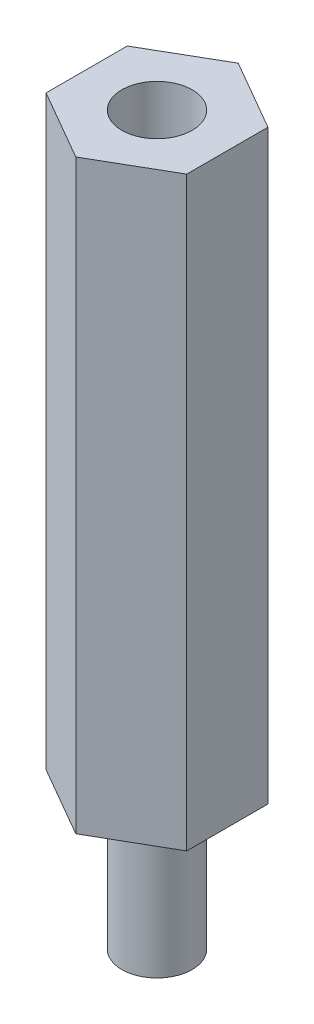
ISO-10303-21;
HEADER;
FILE_DESCRIPTION(('STEP AP214'),'2;1');
FILE_NAME('part.step','',(''),(''),'','','');
FILE_SCHEMA(('AUTOMOTIVE_DESIGN { 1 0 10303 214 1 1 1 1 }'));
ENDSEC;
DATA;
#1=APPLICATION_CONTEXT('core data for automotive mechanical design processes');
#2=APPLICATION_PROTOCOL_DEFINITION('international standard','automotive_design',2000,#1);
#3=PRODUCT_CONTEXT('',#1,'mechanical');
#4=PRODUCT('Part','Part','',(#3));
#5=PRODUCT_RELATED_PRODUCT_CATEGORY('part','',(#4));
#6=PRODUCT_DEFINITION_FORMATION('','',#4);
#7=PRODUCT_DEFINITION_CONTEXT('part definition',#1,'design');
#8=PRODUCT_DEFINITION('design','',#6,#7);
#9=PRODUCT_DEFINITION_SHAPE('','',#8);
#10=(LENGTH_UNIT() NAMED_UNIT(*) SI_UNIT(.MILLI.,.METRE.));
#11=(NAMED_UNIT(*) PLANE_ANGLE_UNIT() SI_UNIT($,.RADIAN.));
#12=(NAMED_UNIT(*) SI_UNIT($,.STERADIAN.) SOLID_ANGLE_UNIT());
#13=UNCERTAINTY_MEASURE_WITH_UNIT(LENGTH_MEASURE(1.E-05),#10,'distance_accuracy_value','');
#14=(GEOMETRIC_REPRESENTATION_CONTEXT(3) GLOBAL_UNCERTAINTY_ASSIGNED_CONTEXT((#13)) GLOBAL_UNIT_ASSIGNED_CONTEXT((#10,
#11,#12)) REPRESENTATION_CONTEXT('',''));
#15=CARTESIAN_POINT('',(0.,0.,0.));
#16=DIRECTION('',(0.,0.,1.));
#17=DIRECTION('',(1.,0.,0.));
#18=AXIS2_PLACEMENT_3D('',#15,#16,#17);
#19=CARTESIAN_POINT('',(2.99999999999999,25.,-1.73205080756888));
#20=DIRECTION('',(-0.499999999999999,0.,0.866025403784439));
#21=DIRECTION('',(0.866025403784439,0.,0.499999999999999));
#22=AXIS2_PLACEMENT_3D('',#19,#20,#21);
#23=PLANE('',#22);
#24=DIRECTION('',(-0.866025403784439,0.,-0.499999999999999));
#25=VECTOR('',#24,1.);
#26=CARTESIAN_POINT('',(2.99999999999999,0.,-1.73205080756888));
#27=LINE('',#26,#25);
#28=CARTESIAN_POINT('',(2.99999999999999,0.,-1.73205080756888));
#29=VERTEX_POINT('',#28);
#30=CARTESIAN_POINT('',(0.,0.,-3.46410161513775));
#31=VERTEX_POINT('',#30);
#32=EDGE_CURVE('E118',#29,#31,#27,.T.);
#33=ORIENTED_EDGE('',*,*,#32,.T.);
#34=DIRECTION('',(0.,-1.,0.));
#35=VECTOR('',#34,1.);
#36=CARTESIAN_POINT('',(0.,25.,-3.46410161513775));
#37=LINE('',#36,#35);
#38=CARTESIAN_POINT('',(0.,25.,-3.46410161513775));
#39=VERTEX_POINT('',#38);
#40=EDGE_CURVE('E11',#39,#31,#37,.T.);
#41=ORIENTED_EDGE('',*,*,#40,.F.);
#42=DIRECTION('',(-0.866025403784439,0.,-0.499999999999999));
#43=VECTOR('',#42,1.);
#44=CARTESIAN_POINT('',(2.99999999999999,25.,-1.73205080756888));
#45=LINE('',#44,#43);
#46=CARTESIAN_POINT('',(2.99999999999999,25.,-1.73205080756888));
#47=VERTEX_POINT('',#46);
#48=EDGE_CURVE('E128',#47,#39,#45,.T.);
#49=ORIENTED_EDGE('',*,*,#48,.F.);
#50=DIRECTION('',(0.,-1.,0.));
#51=VECTOR('',#50,1.);
#52=CARTESIAN_POINT('',(2.99999999999999,25.,-1.73205080756888));
#53=LINE('',#52,#51);
#54=EDGE_CURVE('E114',#47,#29,#53,.T.);
#55=ORIENTED_EDGE('',*,*,#54,.T.);
#56=EDGE_LOOP('',(#33,#41,#49,#55));
#57=FACE_BOUND('',#56,.T.);
#58=ADVANCED_FACE('F33',(#57),#23,.F.);
#59=CARTESIAN_POINT('',(0.,25.,-3.46410161513775));
#60=DIRECTION('',(0.5,0.,0.866025403784438));
#61=DIRECTION('',(0.866025403784438,0.,-0.5));
#62=AXIS2_PLACEMENT_3D('',#59,#60,#61);
#63=PLANE('',#62);
#64=DIRECTION('',(-0.866025403784438,0.,0.5));
#65=VECTOR('',#64,1.);
#66=CARTESIAN_POINT('',(0.,0.,-3.46410161513775));
#67=LINE('',#66,#65);
#68=CARTESIAN_POINT('',(-3.,0.,-1.73205080756888));
#69=VERTEX_POINT('',#68);
#70=EDGE_CURVE('E121',#31,#69,#67,.T.);
#71=ORIENTED_EDGE('',*,*,#70,.T.);
#72=DIRECTION('',(0.,-1.,0.));
#73=VECTOR('',#72,1.);
#74=CARTESIAN_POINT('',(-3.,25.,-1.73205080756888));
#75=LINE('',#74,#73);
#76=CARTESIAN_POINT('',(-3.,25.,-1.73205080756888));
#77=VERTEX_POINT('',#76);
#78=EDGE_CURVE('E42',#77,#69,#75,.T.);
#79=ORIENTED_EDGE('',*,*,#78,.F.);
#80=DIRECTION('',(-0.866025403784438,0.,0.5));
#81=VECTOR('',#80,1.);
#82=CARTESIAN_POINT('',(0.,25.,-3.46410161513775));
#83=LINE('',#82,#81);
#84=EDGE_CURVE('E87',#39,#77,#83,.T.);
#85=ORIENTED_EDGE('',*,*,#84,.F.);
#86=ORIENTED_EDGE('',*,*,#40,.T.);
#87=EDGE_LOOP('',(#71,#79,#85,#86));
#88=FACE_BOUND('',#87,.T.);
#89=ADVANCED_FACE('F154',(#88),#63,.F.);
#90=CARTESIAN_POINT('',(-3.,25.,-1.73205080756888));
#91=DIRECTION('',(1.,0.,0.));
#92=DIRECTION('',(0.,0.,-1.));
#93=AXIS2_PLACEMENT_3D('',#90,#91,#92);
#94=PLANE('',#93);
#95=DIRECTION('',(0.,0.,1.));
#96=VECTOR('',#95,1.);
#97=CARTESIAN_POINT('',(-3.,0.,-1.73205080756888));
#98=LINE('',#97,#96);
#99=CARTESIAN_POINT('',(-3.,0.,1.73205080756888));
#100=VERTEX_POINT('',#99);
#101=EDGE_CURVE('E123',#69,#100,#98,.T.);
#102=ORIENTED_EDGE('',*,*,#101,.T.);
#103=DIRECTION('',(0.,-1.,0.));
#104=VECTOR('',#103,1.);
#105=CARTESIAN_POINT('',(-3.,25.,1.73205080756888));
#106=LINE('',#105,#104);
#107=CARTESIAN_POINT('',(-3.,25.,1.73205080756888));
#108=VERTEX_POINT('',#107);
#109=EDGE_CURVE('E109',#108,#100,#106,.T.);
#110=ORIENTED_EDGE('',*,*,#109,.F.);
#111=DIRECTION('',(0.,0.,1.));
#112=VECTOR('',#111,1.);
#113=CARTESIAN_POINT('',(-3.,25.,-1.73205080756888));
#114=LINE('',#113,#112);
#115=EDGE_CURVE('E100',#77,#108,#114,.T.);
#116=ORIENTED_EDGE('',*,*,#115,.F.);
#117=ORIENTED_EDGE('',*,*,#78,.T.);
#118=EDGE_LOOP('',(#102,#110,#116,#117));
#119=FACE_BOUND('',#118,.T.);
#120=ADVANCED_FACE('F135',(#119),#94,.F.);
#121=CARTESIAN_POINT('',(-3.,25.,1.73205080756888));
#122=DIRECTION('',(0.5,0.,-0.866025403784439));
#123=DIRECTION('',(-0.866025403784439,0.,-0.5));
#124=AXIS2_PLACEMENT_3D('',#121,#122,#123);
#125=PLANE('',#124);
#126=DIRECTION('',(0.866025403784439,0.,0.5));
#127=VECTOR('',#126,1.);
#128=CARTESIAN_POINT('',(-3.,0.,1.73205080756888));
#129=LINE('',#128,#127);
#130=CARTESIAN_POINT('',(0.,0.,3.46410161513776));
#131=VERTEX_POINT('',#130);
#132=EDGE_CURVE('E108',#100,#131,#129,.T.);
#133=ORIENTED_EDGE('',*,*,#132,.T.);
#134=DIRECTION('',(0.,-1.,0.));
#135=VECTOR('',#134,1.);
#136=CARTESIAN_POINT('',(0.,25.,3.46410161513776));
#137=LINE('',#136,#135);
#138=CARTESIAN_POINT('',(0.,25.,3.46410161513776));
#139=VERTEX_POINT('',#138);
#140=EDGE_CURVE('E105',#139,#131,#137,.T.);
#141=ORIENTED_EDGE('',*,*,#140,.F.);
#142=DIRECTION('',(0.866025403784439,0.,0.5));
#143=VECTOR('',#142,1.);
#144=CARTESIAN_POINT('',(-3.,25.,1.73205080756888));
#145=LINE('',#144,#143);
#146=EDGE_CURVE('E94',#108,#139,#145,.T.);
#147=ORIENTED_EDGE('',*,*,#146,.F.);
#148=ORIENTED_EDGE('',*,*,#109,.T.);
#149=EDGE_LOOP('',(#133,#141,#147,#148));
#150=FACE_BOUND('',#149,.T.);
#151=ADVANCED_FACE('F106',(#150),#125,.F.);
#152=CARTESIAN_POINT('',(0.,25.,3.46410161513776));
#153=DIRECTION('',(-0.499999999999999,0.,-0.866025403784439));
#154=DIRECTION('',(-0.866025403784439,0.,0.499999999999999));
#155=AXIS2_PLACEMENT_3D('',#152,#153,#154);
#156=PLANE('',#155);
#157=DIRECTION('',(0.866025403784439,0.,-0.499999999999999));
#158=VECTOR('',#157,1.);
#159=CARTESIAN_POINT('',(0.,0.,3.46410161513776));
#160=LINE('',#159,#158);
#161=CARTESIAN_POINT('',(3.,0.,1.73205080756889));
#162=VERTEX_POINT('',#161);
#163=EDGE_CURVE('E73',#131,#162,#160,.T.);
#164=ORIENTED_EDGE('',*,*,#163,.T.);
#165=DIRECTION('',(0.,-1.,0.));
#166=VECTOR('',#165,1.);
#167=CARTESIAN_POINT('',(3.,25.,1.73205080756889));
#168=LINE('',#167,#166);
#169=CARTESIAN_POINT('',(3.,25.,1.73205080756889));
#170=VERTEX_POINT('',#169);
#171=EDGE_CURVE('E110',#170,#162,#168,.T.);
#172=ORIENTED_EDGE('',*,*,#171,.F.);
#173=DIRECTION('',(0.866025403784439,0.,-0.499999999999999));
#174=VECTOR('',#173,1.);
#175=CARTESIAN_POINT('',(0.,25.,3.46410161513776));
#176=LINE('',#175,#174);
#177=EDGE_CURVE('E98',#139,#170,#176,.T.);
#178=ORIENTED_EDGE('',*,*,#177,.F.);
#179=ORIENTED_EDGE('',*,*,#140,.T.);
#180=EDGE_LOOP('',(#164,#172,#178,#179));
#181=FACE_BOUND('',#180,.T.);
#182=ADVANCED_FACE('F112',(#181),#156,.F.);
#183=CARTESIAN_POINT('',(3.,25.,1.73205080756889));
#184=DIRECTION('',(-1.,0.,0.));
#185=DIRECTION('',(0.,0.,1.));
#186=AXIS2_PLACEMENT_3D('',#183,#184,#185);
#187=PLANE('',#186);
#188=DIRECTION('',(0.,0.,-1.));
#189=VECTOR('',#188,1.);
#190=CARTESIAN_POINT('',(3.,0.,1.73205080756889));
#191=LINE('',#190,#189);
#192=EDGE_CURVE('E79',#162,#29,#191,.T.);
#193=ORIENTED_EDGE('',*,*,#192,.T.);
#194=ORIENTED_EDGE('',*,*,#54,.F.);
#195=DIRECTION('',(0.,0.,-1.));
#196=VECTOR('',#195,1.);
#197=CARTESIAN_POINT('',(3.,25.,1.73205080756889));
#198=LINE('',#197,#196);
#199=EDGE_CURVE('E50',#170,#47,#198,.T.);
#200=ORIENTED_EDGE('',*,*,#199,.F.);
#201=ORIENTED_EDGE('',*,*,#171,.T.);
#202=EDGE_LOOP('',(#193,#194,#200,#201));
#203=FACE_BOUND('',#202,.T.);
#204=ADVANCED_FACE('F142',(#203),#187,.F.);
#205=CARTESIAN_POINT('',(0.,25.,0.));
#206=DIRECTION('',(0.,1.,0.));
#207=DIRECTION('',(0.,0.,1.));
#208=AXIS2_PLACEMENT_3D('',#205,#206,#207);
#209=PLANE('',#208);
#210=CARTESIAN_POINT('',(0.,25.,0.));
#211=DIRECTION('',(0.,1.,0.));
#212=DIRECTION('',(0.,0.,1.));
#213=AXIS2_PLACEMENT_3D('',#210,#211,#212);
#214=CIRCLE('',#213,1.5);
#215=CARTESIAN_POINT('',(0.,25.,1.5));
#216=VERTEX_POINT('',#215);
#217=EDGE_CURVE('E238',#216,#216,#214,.T.);
#218=ORIENTED_EDGE('',*,*,#217,.F.);
#219=EDGE_LOOP('',(#218));
#220=FACE_BOUND('',#219,.T.);
#221=ORIENTED_EDGE('',*,*,#48,.T.);
#222=ORIENTED_EDGE('',*,*,#84,.T.);
#223=ORIENTED_EDGE('',*,*,#115,.T.);
#224=ORIENTED_EDGE('',*,*,#146,.T.);
#225=ORIENTED_EDGE('',*,*,#177,.T.);
#226=ORIENTED_EDGE('',*,*,#199,.T.);
#227=EDGE_LOOP('',(#221,#222,#223,#224,#225,#226));
#228=FACE_BOUND('',#227,.T.);
#229=ADVANCED_FACE('F96',(#220,#228),#209,.T.);
#230=CARTESIAN_POINT('',(0.,0.,0.));
#231=DIRECTION('',(0.,1.,0.));
#232=DIRECTION('',(0.,0.,1.));
#233=AXIS2_PLACEMENT_3D('',#230,#231,#232);
#234=PLANE('',#233);
#235=CARTESIAN_POINT('',(0.,0.,0.));
#236=DIRECTION('',(0.,1.,0.));
#237=DIRECTION('',(0.,0.,1.));
#238=AXIS2_PLACEMENT_3D('',#235,#236,#237);
#239=CIRCLE('',#238,1.5);
#240=CARTESIAN_POINT('',(0.,0.,1.5));
#241=VERTEX_POINT('',#240);
#242=EDGE_CURVE('E36',#241,#241,#239,.T.);
#243=ORIENTED_EDGE('',*,*,#242,.T.);
#244=EDGE_LOOP('',(#243));
#245=FACE_BOUND('',#244,.T.);
#246=ORIENTED_EDGE('',*,*,#32,.F.);
#247=ORIENTED_EDGE('',*,*,#192,.F.);
#248=ORIENTED_EDGE('',*,*,#163,.F.);
#249=ORIENTED_EDGE('',*,*,#132,.F.);
#250=ORIENTED_EDGE('',*,*,#101,.F.);
#251=ORIENTED_EDGE('',*,*,#70,.F.);
#252=EDGE_LOOP('',(#246,#247,#248,#249,#250,#251));
#253=FACE_BOUND('',#252,.T.);
#254=ADVANCED_FACE('F138',(#245,#253),#234,.F.);
#255=CARTESIAN_POINT('',(0.,-6.,0.));
#256=DIRECTION('',(0.,1.,0.));
#257=DIRECTION('',(0.,0.,1.));
#258=AXIS2_PLACEMENT_3D('',#255,#256,#257);
#259=CYLINDRICAL_SURFACE('',#258,1.5);
#260=CARTESIAN_POINT('',(0.,-6.,0.));
#261=DIRECTION('',(0.,1.,0.));
#262=DIRECTION('',(0.,0.,1.));
#263=AXIS2_PLACEMENT_3D('',#260,#261,#262);
#264=CIRCLE('',#263,1.5);
#265=CARTESIAN_POINT('',(0.,-6.,1.5));
#266=VERTEX_POINT('',#265);
#267=EDGE_CURVE('E237',#266,#266,#264,.T.);
#268=ORIENTED_EDGE('',*,*,#267,.T.);
#269=EDGE_LOOP('',(#268));
#270=FACE_BOUND('',#269,.T.);
#271=ORIENTED_EDGE('',*,*,#242,.F.);
#272=EDGE_LOOP('',(#271));
#273=FACE_BOUND('',#272,.T.);
#274=ADVANCED_FACE('F186',(#270,#273),#259,.T.);
#275=CARTESIAN_POINT('',(0.,-6.,0.));
#276=DIRECTION('',(0.,1.,0.));
#277=DIRECTION('',(0.,0.,1.));
#278=AXIS2_PLACEMENT_3D('',#275,#276,#277);
#279=PLANE('',#278);
#280=ORIENTED_EDGE('',*,*,#267,.F.);
#281=EDGE_LOOP('',(#280));
#282=FACE_BOUND('',#281,.T.);
#283=ADVANCED_FACE('F195',(#282),#279,.F.);
#284=CARTESIAN_POINT('',(0.,20.,0.));
#285=DIRECTION('',(0.,1.,0.));
#286=DIRECTION('',(0.,0.,1.));
#287=AXIS2_PLACEMENT_3D('',#284,#285,#286);
#288=CYLINDRICAL_SURFACE('',#287,1.5);
#289=CARTESIAN_POINT('',(0.,20.,0.));
#290=DIRECTION('',(0.,1.,0.));
#291=DIRECTION('',(0.,0.,1.));
#292=AXIS2_PLACEMENT_3D('',#289,#290,#291);
#293=CIRCLE('',#292,1.5);
#294=CARTESIAN_POINT('',(0.,20.,1.5));
#295=VERTEX_POINT('',#294);
#296=EDGE_CURVE('E236',#295,#295,#293,.T.);
#297=ORIENTED_EDGE('',*,*,#296,.F.);
#298=EDGE_LOOP('',(#297));
#299=FACE_BOUND('',#298,.T.);
#300=ORIENTED_EDGE('',*,*,#217,.T.);
#301=EDGE_LOOP('',(#300));
#302=FACE_BOUND('',#301,.T.);
#303=ADVANCED_FACE('F205',(#299,#302),#288,.F.);
#304=CARTESIAN_POINT('',(0.,20.,0.));
#305=DIRECTION('',(0.,1.,0.));
#306=DIRECTION('',(0.,0.,1.));
#307=AXIS2_PLACEMENT_3D('',#304,#305,#306);
#308=PLANE('',#307);
#309=ORIENTED_EDGE('',*,*,#296,.T.);
#310=EDGE_LOOP('',(#309));
#311=FACE_BOUND('',#310,.T.);
#312=ADVANCED_FACE('F220',(#311),#308,.T.);
#313=CLOSED_SHELL('',(#58,#89,#120,#151,#182,#204,#229,#254,#274,#283,#303,#312));
#314=MANIFOLD_SOLID_BREP('B2',#313);
#315=ADVANCED_BREP_SHAPE_REPRESENTATION('',(#18,#314),#14);
#316=SHAPE_DEFINITION_REPRESENTATION(#9,#315);
ENDSEC;
END-ISO-10303-21;
